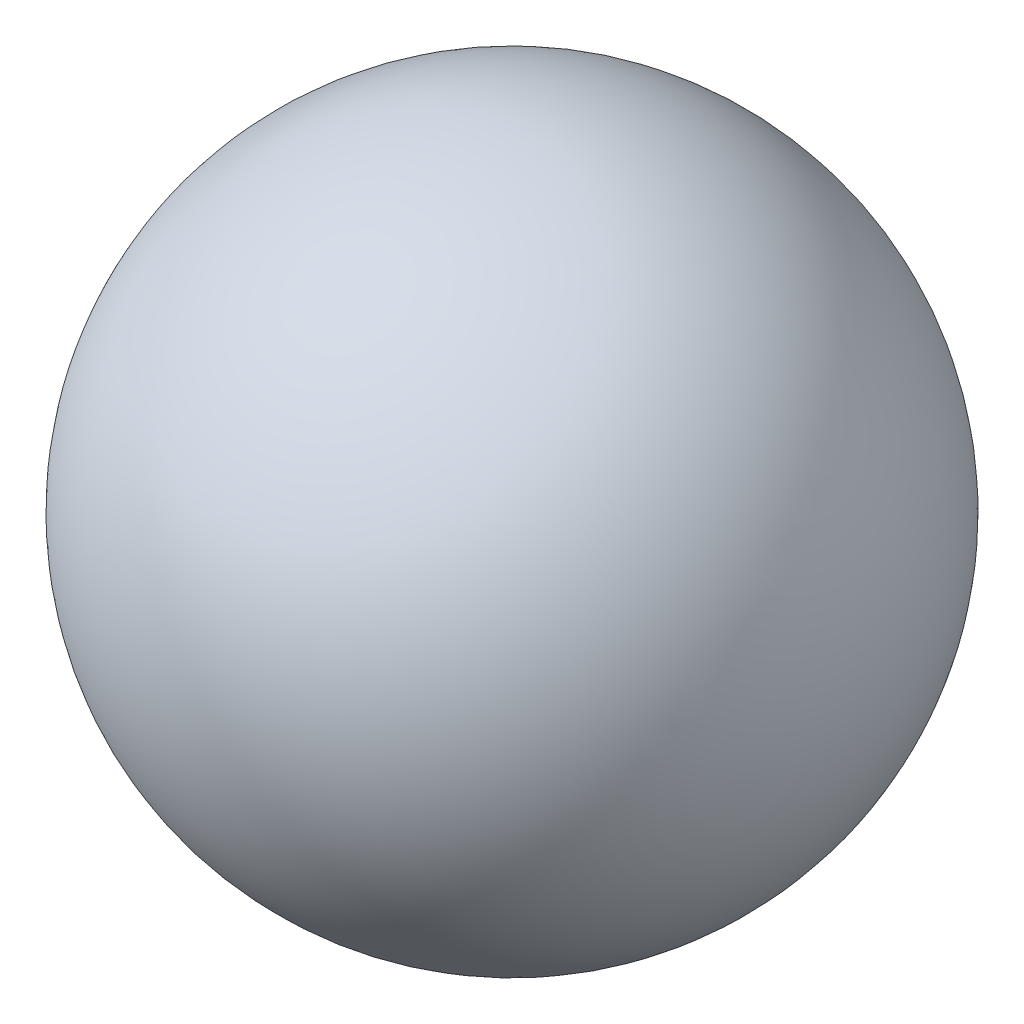
ISO-10303-21;
HEADER;
FILE_DESCRIPTION(('STEP AP214'),'2;1');
FILE_NAME('part.step','',(''),(''),'','','');
FILE_SCHEMA(('AUTOMOTIVE_DESIGN { 1 0 10303 214 1 1 1 1 }'));
ENDSEC;
DATA;
#1=APPLICATION_CONTEXT('core data for automotive mechanical design processes');
#2=APPLICATION_PROTOCOL_DEFINITION('international standard','automotive_design',2000,#1);
#3=PRODUCT_CONTEXT('',#1,'mechanical');
#4=PRODUCT('Part','Part','',(#3));
#5=PRODUCT_RELATED_PRODUCT_CATEGORY('part','',(#4));
#6=PRODUCT_DEFINITION_FORMATION('','',#4);
#7=PRODUCT_DEFINITION_CONTEXT('part definition',#1,'design');
#8=PRODUCT_DEFINITION('design','',#6,#7);
#9=PRODUCT_DEFINITION_SHAPE('','',#8);
#10=(LENGTH_UNIT() NAMED_UNIT(*) SI_UNIT(.MILLI.,.METRE.));
#11=(NAMED_UNIT(*) PLANE_ANGLE_UNIT() SI_UNIT($,.RADIAN.));
#12=(NAMED_UNIT(*) SI_UNIT($,.STERADIAN.) SOLID_ANGLE_UNIT());
#13=UNCERTAINTY_MEASURE_WITH_UNIT(LENGTH_MEASURE(1.E-05),#10,'distance_accuracy_value','');
#14=(GEOMETRIC_REPRESENTATION_CONTEXT(3) GLOBAL_UNCERTAINTY_ASSIGNED_CONTEXT((#13)) GLOBAL_UNIT_ASSIGNED_CONTEXT((#10,
#11,#12)) REPRESENTATION_CONTEXT('',''));
#15=CARTESIAN_POINT('',(0.,0.,0.));
#16=DIRECTION('',(0.,0.,1.));
#17=DIRECTION('',(1.,0.,0.));
#18=AXIS2_PLACEMENT_3D('',#15,#16,#17);
#19=CARTESIAN_POINT('',(0.,0.,0.));
#20=DIRECTION('',(-1.,0.,0.));
#21=DIRECTION('',(0.,0.,-1.));
#22=AXIS2_PLACEMENT_3D('',#19,#20,#21);
#23=SPHERICAL_SURFACE('',#22,120.);
#24=CARTESIAN_POINT('',(-120.,0.,0.));
#25=VERTEX_POINT('',#24);
#26=VERTEX_LOOP('',#25);
#27=FACE_BOUND('',#26,.T.);
#28=ADVANCED_FACE('F37',(#27),#23,.T.);
#29=CLOSED_SHELL('',(#28));
#30=MANIFOLD_SOLID_BREP('B2',#29);
#31=ADVANCED_BREP_SHAPE_REPRESENTATION('',(#18,#30),#14);
#32=SHAPE_DEFINITION_REPRESENTATION(#9,#31);
ENDSEC;
END-ISO-10303-21;
